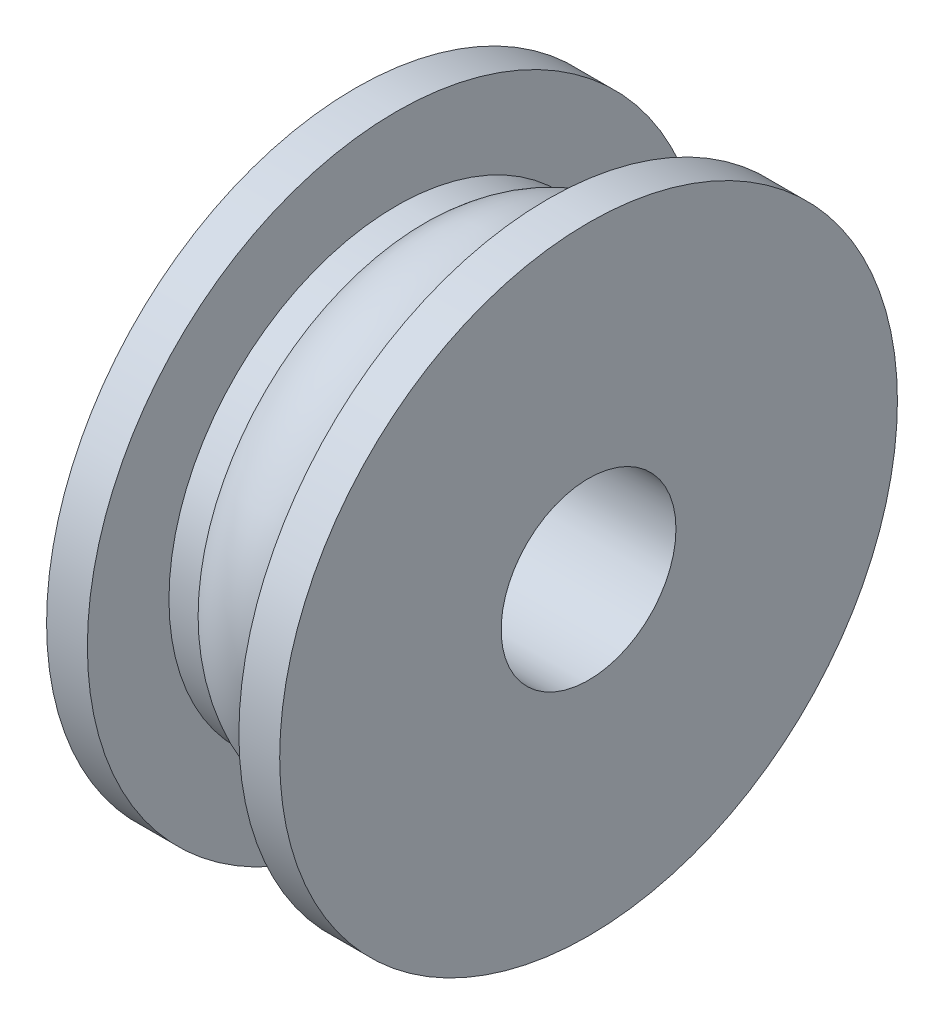
ISO-10303-21;
HEADER;
FILE_DESCRIPTION(('STEP AP214'),'2;1');
FILE_NAME('part.step','',(''),(''),'','','');
FILE_SCHEMA(('AUTOMOTIVE_DESIGN { 1 0 10303 214 1 1 1 1 }'));
ENDSEC;
DATA;
#1=APPLICATION_CONTEXT('core data for automotive mechanical design processes');
#2=APPLICATION_PROTOCOL_DEFINITION('international standard','automotive_design',2000,#1);
#3=PRODUCT_CONTEXT('',#1,'mechanical');
#4=PRODUCT('Part','Part','',(#3));
#5=PRODUCT_RELATED_PRODUCT_CATEGORY('part','',(#4));
#6=PRODUCT_DEFINITION_FORMATION('','',#4);
#7=PRODUCT_DEFINITION_CONTEXT('part definition',#1,'design');
#8=PRODUCT_DEFINITION('design','',#6,#7);
#9=PRODUCT_DEFINITION_SHAPE('','',#8);
#10=(LENGTH_UNIT() NAMED_UNIT(*) SI_UNIT(.MILLI.,.METRE.));
#11=(NAMED_UNIT(*) PLANE_ANGLE_UNIT() SI_UNIT($,.RADIAN.));
#12=(NAMED_UNIT(*) SI_UNIT($,.STERADIAN.) SOLID_ANGLE_UNIT());
#13=UNCERTAINTY_MEASURE_WITH_UNIT(LENGTH_MEASURE(1.E-05),#10,'distance_accuracy_value','');
#14=(GEOMETRIC_REPRESENTATION_CONTEXT(3) GLOBAL_UNCERTAINTY_ASSIGNED_CONTEXT((#13)) GLOBAL_UNIT_ASSIGNED_CONTEXT((#10,
#11,#12)) REPRESENTATION_CONTEXT('',''));
#15=CARTESIAN_POINT('',(0.,0.,0.));
#16=DIRECTION('',(0.,0.,1.));
#17=DIRECTION('',(1.,0.,0.));
#18=AXIS2_PLACEMENT_3D('',#15,#16,#17);
#19=CARTESIAN_POINT('',(-2.,5.3,0.));
#20=DIRECTION('',(1.,0.,0.));
#21=DIRECTION('',(0.,0.,-1.));
#22=AXIS2_PLACEMENT_3D('',#19,#20,#21);
#23=PLANE('',#22);
#24=CARTESIAN_POINT('',(-2.,0.,0.));
#25=DIRECTION('',(1.,0.,0.));
#26=DIRECTION('',(0.,0.,-1.));
#27=AXIS2_PLACEMENT_3D('',#24,#25,#26);
#28=CIRCLE('',#27,1.5);
#29=CARTESIAN_POINT('',(-2.,0.,-1.5));
#30=VERTEX_POINT('',#29);
#31=EDGE_CURVE('E68',#30,#30,#28,.T.);
#32=ORIENTED_EDGE('',*,*,#31,.T.);
#33=EDGE_LOOP('',(#32));
#34=FACE_BOUND('',#33,.T.);
#35=CARTESIAN_POINT('',(-2.,0.,0.));
#36=DIRECTION('',(-1.,0.,0.));
#37=DIRECTION('',(0.,0.,1.));
#38=AXIS2_PLACEMENT_3D('',#35,#36,#37);
#39=CIRCLE('',#38,5.3);
#40=CARTESIAN_POINT('',(-2.,0.,5.3));
#41=VERTEX_POINT('',#40);
#42=EDGE_CURVE('E10',#41,#41,#39,.T.);
#43=ORIENTED_EDGE('',*,*,#42,.T.);
#44=EDGE_LOOP('',(#43));
#45=FACE_BOUND('',#44,.T.);
#46=ADVANCED_FACE('F34',(#34,#45),#23,.F.);
#47=CARTESIAN_POINT('',(0.,0.,0.));
#48=DIRECTION('',(-1.,0.,0.));
#49=DIRECTION('',(0.,0.,1.));
#50=AXIS2_PLACEMENT_3D('',#47,#48,#49);
#51=CYLINDRICAL_SURFACE('',#50,5.3);
#52=ORIENTED_EDGE('',*,*,#42,.F.);
#53=EDGE_LOOP('',(#52));
#54=FACE_BOUND('',#53,.T.);
#55=CARTESIAN_POINT('',(-1.3,0.,0.));
#56=DIRECTION('',(-1.,0.,0.));
#57=DIRECTION('',(0.,0.,1.));
#58=AXIS2_PLACEMENT_3D('',#55,#56,#57);
#59=CIRCLE('',#58,5.3);
#60=CARTESIAN_POINT('',(-1.3,0.,5.3));
#61=VERTEX_POINT('',#60);
#62=EDGE_CURVE('E41',#61,#61,#59,.T.);
#63=ORIENTED_EDGE('',*,*,#62,.T.);
#64=EDGE_LOOP('',(#63));
#65=FACE_BOUND('',#64,.T.);
#66=ADVANCED_FACE('F97',(#54,#65),#51,.T.);
#67=CARTESIAN_POINT('',(-1.3,5.3,0.));
#68=DIRECTION('',(-1.,0.,0.));
#69=DIRECTION('',(0.,0.,1.));
#70=AXIS2_PLACEMENT_3D('',#67,#68,#69);
#71=PLANE('',#70);
#72=ORIENTED_EDGE('',*,*,#62,.F.);
#73=EDGE_LOOP('',(#72));
#74=FACE_BOUND('',#73,.T.);
#75=CARTESIAN_POINT('',(-1.3,0.,0.));
#76=DIRECTION('',(-1.,0.,0.));
#77=DIRECTION('',(0.,0.,1.));
#78=AXIS2_PLACEMENT_3D('',#75,#76,#77);
#79=CIRCLE('',#78,3.9);
#80=CARTESIAN_POINT('',(-1.3,0.,3.9));
#81=VERTEX_POINT('',#80);
#82=EDGE_CURVE('E44',#81,#81,#79,.T.);
#83=ORIENTED_EDGE('',*,*,#82,.T.);
#84=EDGE_LOOP('',(#83));
#85=FACE_BOUND('',#84,.T.);
#86=ADVANCED_FACE('F103',(#74,#85),#71,.F.);
#87=CARTESIAN_POINT('',(0.,0.,0.));
#88=DIRECTION('',(-1.,0.,0.));
#89=DIRECTION('',(0.,0.,1.));
#90=AXIS2_PLACEMENT_3D('',#87,#88,#89);
#91=CYLINDRICAL_SURFACE('',#90,3.9);
#92=ORIENTED_EDGE('',*,*,#82,.F.);
#93=EDGE_LOOP('',(#92));
#94=FACE_BOUND('',#93,.T.);
#95=CARTESIAN_POINT('',(-0.8,0.,0.));
#96=DIRECTION('',(-1.,0.,0.));
#97=DIRECTION('',(0.,0.,1.));
#98=AXIS2_PLACEMENT_3D('',#95,#96,#97);
#99=CIRCLE('',#98,3.9);
#100=CARTESIAN_POINT('',(-0.8,0.,3.9));
#101=VERTEX_POINT('',#100);
#102=EDGE_CURVE('E47',#101,#101,#99,.T.);
#103=ORIENTED_EDGE('',*,*,#102,.T.);
#104=EDGE_LOOP('',(#103));
#105=FACE_BOUND('',#104,.T.);
#106=ADVANCED_FACE('F107',(#94,#105),#91,.T.);
#107=CARTESIAN_POINT('',(0.,0.,0.));
#108=DIRECTION('',(-1.,0.,0.));
#109=DIRECTION('',(0.,0.,1.));
#110=AXIS2_PLACEMENT_3D('',#107,#108,#109);
#111=TOROIDAL_SURFACE('',#110,2.99639144282831,1.20685890832106);
#112=ORIENTED_EDGE('',*,*,#102,.F.);
#113=EDGE_LOOP('',(#112));
#114=FACE_BOUND('',#113,.T.);
#115=CARTESIAN_POINT('',(0.799999999999999,0.,0.));
#116=DIRECTION('',(-1.,0.,0.));
#117=DIRECTION('',(0.,0.,1.));
#118=AXIS2_PLACEMENT_3D('',#115,#116,#117);
#119=CIRCLE('',#118,3.9);
#120=CARTESIAN_POINT('',(0.799999999999999,0.,3.9));
#121=VERTEX_POINT('',#120);
#122=EDGE_CURVE('E53',#121,#121,#119,.T.);
#123=ORIENTED_EDGE('',*,*,#122,.T.);
#124=EDGE_LOOP('',(#123));
#125=FACE_BOUND('',#124,.T.);
#126=ADVANCED_FACE('F111',(#114,#125),#111,.T.);
#127=CARTESIAN_POINT('',(0.,0.,0.));
#128=DIRECTION('',(-1.,0.,0.));
#129=DIRECTION('',(0.,0.,1.));
#130=AXIS2_PLACEMENT_3D('',#127,#128,#129);
#131=CYLINDRICAL_SURFACE('',#130,3.9);
#132=ORIENTED_EDGE('',*,*,#122,.F.);
#133=EDGE_LOOP('',(#132));
#134=FACE_BOUND('',#133,.T.);
#135=CARTESIAN_POINT('',(1.3,0.,0.));
#136=DIRECTION('',(-1.,0.,0.));
#137=DIRECTION('',(0.,0.,1.));
#138=AXIS2_PLACEMENT_3D('',#135,#136,#137);
#139=CIRCLE('',#138,3.9);
#140=CARTESIAN_POINT('',(1.3,0.,3.9));
#141=VERTEX_POINT('',#140);
#142=EDGE_CURVE('E60',#141,#141,#139,.T.);
#143=ORIENTED_EDGE('',*,*,#142,.T.);
#144=EDGE_LOOP('',(#143));
#145=FACE_BOUND('',#144,.T.);
#146=ADVANCED_FACE('F92',(#134,#145),#131,.T.);
#147=CARTESIAN_POINT('',(1.3,5.3,0.));
#148=DIRECTION('',(1.,0.,0.));
#149=DIRECTION('',(0.,0.,-1.));
#150=AXIS2_PLACEMENT_3D('',#147,#148,#149);
#151=PLANE('',#150);
#152=ORIENTED_EDGE('',*,*,#142,.F.);
#153=EDGE_LOOP('',(#152));
#154=FACE_BOUND('',#153,.T.);
#155=CARTESIAN_POINT('',(1.3,0.,0.));
#156=DIRECTION('',(-1.,0.,0.));
#157=DIRECTION('',(0.,0.,1.));
#158=AXIS2_PLACEMENT_3D('',#155,#156,#157);
#159=CIRCLE('',#158,5.3);
#160=CARTESIAN_POINT('',(1.3,0.,5.3));
#161=VERTEX_POINT('',#160);
#162=EDGE_CURVE('E58',#161,#161,#159,.T.);
#163=ORIENTED_EDGE('',*,*,#162,.T.);
#164=EDGE_LOOP('',(#163));
#165=FACE_BOUND('',#164,.T.);
#166=ADVANCED_FACE('F86',(#154,#165),#151,.F.);
#167=CARTESIAN_POINT('',(0.,0.,0.));
#168=DIRECTION('',(-1.,0.,0.));
#169=DIRECTION('',(0.,0.,1.));
#170=AXIS2_PLACEMENT_3D('',#167,#168,#169);
#171=CYLINDRICAL_SURFACE('',#170,5.3);
#172=ORIENTED_EDGE('',*,*,#162,.F.);
#173=EDGE_LOOP('',(#172));
#174=FACE_BOUND('',#173,.T.);
#175=CARTESIAN_POINT('',(2.,0.,0.));
#176=DIRECTION('',(-1.,0.,0.));
#177=DIRECTION('',(0.,0.,1.));
#178=AXIS2_PLACEMENT_3D('',#175,#176,#177);
#179=CIRCLE('',#178,5.3);
#180=CARTESIAN_POINT('',(2.,0.,5.3));
#181=VERTEX_POINT('',#180);
#182=EDGE_CURVE('E64',#181,#181,#179,.T.);
#183=ORIENTED_EDGE('',*,*,#182,.T.);
#184=EDGE_LOOP('',(#183));
#185=FACE_BOUND('',#184,.T.);
#186=ADVANCED_FACE('F81',(#174,#185),#171,.T.);
#187=CARTESIAN_POINT('',(2.,0.,0.));
#188=DIRECTION('',(-1.,0.,0.));
#189=DIRECTION('',(0.,0.,1.));
#190=AXIS2_PLACEMENT_3D('',#187,#188,#189);
#191=PLANE('',#190);
#192=CARTESIAN_POINT('',(2.,0.,0.));
#193=DIRECTION('',(1.,0.,0.));
#194=DIRECTION('',(0.,0.,-1.));
#195=AXIS2_PLACEMENT_3D('',#192,#193,#194);
#196=CIRCLE('',#195,1.5);
#197=CARTESIAN_POINT('',(2.,0.,-1.5));
#198=VERTEX_POINT('',#197);
#199=EDGE_CURVE('E70',#198,#198,#196,.T.);
#200=ORIENTED_EDGE('',*,*,#199,.F.);
#201=EDGE_LOOP('',(#200));
#202=FACE_BOUND('',#201,.T.);
#203=ORIENTED_EDGE('',*,*,#182,.F.);
#204=EDGE_LOOP('',(#203));
#205=FACE_BOUND('',#204,.T.);
#206=ADVANCED_FACE('F80',(#202,#205),#191,.F.);
#207=CARTESIAN_POINT('',(-2.,0.,0.));
#208=DIRECTION('',(1.,0.,0.));
#209=DIRECTION('',(0.,0.,-1.));
#210=AXIS2_PLACEMENT_3D('',#207,#208,#209);
#211=CYLINDRICAL_SURFACE('',#210,1.5);
#212=ORIENTED_EDGE('',*,*,#31,.F.);
#213=EDGE_LOOP('',(#212));
#214=FACE_BOUND('',#213,.T.);
#215=ORIENTED_EDGE('',*,*,#199,.T.);
#216=EDGE_LOOP('',(#215));
#217=FACE_BOUND('',#216,.T.);
#218=ADVANCED_FACE('F74',(#214,#217),#211,.F.);
#219=CLOSED_SHELL('',(#46,#66,#86,#106,#126,#146,#166,#186,#206,#218));
#220=MANIFOLD_SOLID_BREP('B2',#219);
#221=ADVANCED_BREP_SHAPE_REPRESENTATION('',(#18,#220),#14);
#222=SHAPE_DEFINITION_REPRESENTATION(#9,#221);
ENDSEC;
END-ISO-10303-21;
